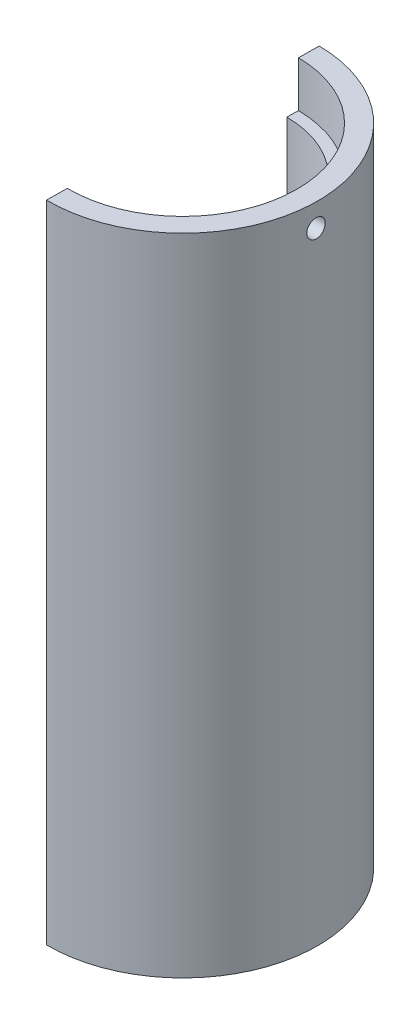
ISO-10303-21;
HEADER;
FILE_DESCRIPTION(('STEP AP214'),'2;1');
FILE_NAME('part.step','',(''),(''),'','','');
FILE_SCHEMA(('AUTOMOTIVE_DESIGN { 1 0 10303 214 1 1 1 1 }'));
ENDSEC;
DATA;
#1=APPLICATION_CONTEXT('core data for automotive mechanical design processes');
#2=APPLICATION_PROTOCOL_DEFINITION('international standard','automotive_design',2000,#1);
#3=PRODUCT_CONTEXT('',#1,'mechanical');
#4=PRODUCT('Part','Part','',(#3));
#5=PRODUCT_RELATED_PRODUCT_CATEGORY('part','',(#4));
#6=PRODUCT_DEFINITION_FORMATION('','',#4);
#7=PRODUCT_DEFINITION_CONTEXT('part definition',#1,'design');
#8=PRODUCT_DEFINITION('design','',#6,#7);
#9=PRODUCT_DEFINITION_SHAPE('','',#8);
#10=(LENGTH_UNIT() NAMED_UNIT(*) SI_UNIT(.MILLI.,.METRE.));
#11=(NAMED_UNIT(*) PLANE_ANGLE_UNIT() SI_UNIT($,.RADIAN.));
#12=(NAMED_UNIT(*) SI_UNIT($,.STERADIAN.) SOLID_ANGLE_UNIT());
#13=UNCERTAINTY_MEASURE_WITH_UNIT(LENGTH_MEASURE(1.E-05),#10,'distance_accuracy_value','');
#14=(GEOMETRIC_REPRESENTATION_CONTEXT(3) GLOBAL_UNCERTAINTY_ASSIGNED_CONTEXT((#13)) GLOBAL_UNIT_ASSIGNED_CONTEXT((#10,
#11,#12)) REPRESENTATION_CONTEXT('',''));
#15=CARTESIAN_POINT('',(0.,0.,0.));
#16=DIRECTION('',(0.,0.,1.));
#17=DIRECTION('',(1.,0.,0.));
#18=AXIS2_PLACEMENT_3D('',#15,#16,#17);
#19=CARTESIAN_POINT('',(0.,158.,0.));
#20=DIRECTION('',(0.,-1.,0.));
#21=DIRECTION('',(-0.401283076270889,0.,0.915954088750398));
#22=AXIS2_PLACEMENT_3D('',#19,#20,#21);
#23=CYLINDRICAL_SURFACE('',#22,22.5);
#24=DIRECTION('',(0.,-1.,0.));
#25=VECTOR('',#24,1.);
#26=CARTESIAN_POINT('',(-0.246759675838968,158.,22.4986468406965));
#27=LINE('',#26,#25);
#28=CARTESIAN_POINT('',(-0.246759675838986,119.,22.4986468406965));
#29=VERTEX_POINT('',#28);
#30=CARTESIAN_POINT('',(-0.246759675838977,157.,22.4986468406965));
#31=VERTEX_POINT('',#30);
#32=EDGE_CURVE('E339',#29,#31,#27,.F.);
#33=ORIENTED_EDGE('',*,*,#32,.T.);
#34=CARTESIAN_POINT('',(0.,157.,0.));
#35=DIRECTION('',(0.,-1.,0.));
#36=DIRECTION('',(0.,0.,1.));
#37=AXIS2_PLACEMENT_3D('',#34,#35,#36);
#38=CIRCLE('',#37,22.5);
#39=CARTESIAN_POINT('',(0.246759675839023,157.,-22.4986468406964));
#40=VERTEX_POINT('',#39);
#41=EDGE_CURVE('E186',#40,#31,#38,.T.);
#42=ORIENTED_EDGE('',*,*,#41,.F.);
#43=DIRECTION('',(0.,-1.,0.));
#44=VECTOR('',#43,1.);
#45=CARTESIAN_POINT('',(0.246759675839024,158.,-22.4986468406964));
#46=LINE('',#45,#44);
#47=CARTESIAN_POINT('',(0.246759675838999,119.,-22.4986468406964));
#48=VERTEX_POINT('',#47);
#49=EDGE_CURVE('E172',#48,#40,#46,.F.);
#50=ORIENTED_EDGE('',*,*,#49,.F.);
#51=CARTESIAN_POINT('',(0.,119.,0.));
#52=DIRECTION('',(0.,1.,0.));
#53=DIRECTION('',(0.,0.,-1.));
#54=AXIS2_PLACEMENT_3D('',#51,#52,#53);
#55=CIRCLE('',#54,22.5);
#56=EDGE_CURVE('E194',#29,#48,#55,.T.);
#57=ORIENTED_EDGE('',*,*,#56,.F.);
#58=EDGE_LOOP('',(#33,#42,#50,#57));
#59=FACE_BOUND('',#58,.T.);
#60=ADVANCED_FACE('F49',(#59),#23,.F.);
#61=CARTESIAN_POINT('',(0.112412741215621,247.,-10.2493835607617));
#62=DIRECTION('',(0.999939859586508,0.,0.0109670967039555));
#63=DIRECTION('',(-0.0109670967039554,0.,0.999939859586508));
#64=AXIS2_PLACEMENT_3D('',#61,#62,#63);
#65=PLANE('',#64);
#66=DIRECTION('',(-0.0109670967039562,0.,0.999939859586508));
#67=VECTOR('',#66,1.);
#68=CARTESIAN_POINT('',(0.257726772542979,157.,-23.4985867002829));
#69=LINE('',#68,#67);
#70=CARTESIAN_POINT('',(0.257726772542979,157.,-23.4985867002829));
#71=VERTEX_POINT('',#70);
#72=EDGE_CURVE('E176',#71,#40,#69,.T.);
#73=ORIENTED_EDGE('',*,*,#72,.F.);
#74=DIRECTION('',(0.,-1.,0.));
#75=VECTOR('',#74,1.);
#76=CARTESIAN_POINT('',(0.257726772542985,170.,-23.4985867002829));
#77=LINE('',#76,#75);
#78=CARTESIAN_POINT('',(0.257726772542985,170.,-23.4985867002829));
#79=VERTEX_POINT('',#78);
#80=EDGE_CURVE('E160',#71,#79,#77,.F.);
#81=ORIENTED_EDGE('',*,*,#80,.T.);
#82=DIRECTION('',(0.0109670967039554,0.,-0.999939859586508));
#83=VECTOR('',#82,1.);
#84=CARTESIAN_POINT('',(0.,170.,0.));
#85=LINE('',#84,#83);
#86=CARTESIAN_POINT('',(0.246759675839029,170.,-22.4986468406964));
#87=VERTEX_POINT('',#86);
#88=EDGE_CURVE('E324',#87,#79,#85,.T.);
#89=ORIENTED_EDGE('',*,*,#88,.F.);
#90=DIRECTION('',(0.,-1.,0.));
#91=VECTOR('',#90,1.);
#92=CARTESIAN_POINT('',(0.24675967583907,247.,-22.4986468406963));
#93=LINE('',#92,#91);
#94=CARTESIAN_POINT('',(0.246759675839067,237.,-22.4986468406963));
#95=VERTEX_POINT('',#94);
#96=EDGE_CURVE('E309',#87,#95,#93,.F.);
#97=ORIENTED_EDGE('',*,*,#96,.T.);
#98=DIRECTION('',(0.0109670967039554,0.,-0.999939859586508));
#99=VECTOR('',#98,1.);
#100=CARTESIAN_POINT('',(0.,237.,1.28191555927795E-13));
#101=LINE('',#100,#99);
#102=CARTESIAN_POINT('',(0.274177417598957,237.,-24.9984964896626));
#103=VERTEX_POINT('',#102);
#104=EDGE_CURVE('E59',#95,#103,#101,.T.);
#105=ORIENTED_EDGE('',*,*,#104,.T.);
#106=DIRECTION('',(0.,1.,0.));
#107=VECTOR('',#106,1.);
#108=CARTESIAN_POINT('',(0.274177417598957,237.,-24.9984964896626));
#109=LINE('',#108,#107);
#110=CARTESIAN_POINT('',(0.27417741759896,247.,-24.9984964896626));
#111=VERTEX_POINT('',#110);
#112=EDGE_CURVE('E293',#111,#103,#109,.F.);
#113=ORIENTED_EDGE('',*,*,#112,.F.);
#114=DIRECTION('',(0.0109670967039554,0.,-0.999939859586508));
#115=VECTOR('',#114,1.);
#116=CARTESIAN_POINT('',(0.,247.,1.33348633457717E-13));
#117=LINE('',#116,#115);
#118=CARTESIAN_POINT('',(0.323529352766761,247.,-29.4982258578019));
#119=VERTEX_POINT('',#118);
#120=EDGE_CURVE('E283',#111,#119,#117,.T.);
#121=ORIENTED_EDGE('',*,*,#120,.T.);
#122=DIRECTION('',(0.,-1.,0.));
#123=VECTOR('',#122,1.);
#124=CARTESIAN_POINT('',(0.323529352766681,106.,-29.498225857802));
#125=LINE('',#124,#123);
#126=CARTESIAN_POINT('',(0.323529352766681,106.,-29.498225857802));
#127=VERTEX_POINT('',#126);
#128=EDGE_CURVE('E286',#127,#119,#125,.F.);
#129=ORIENTED_EDGE('',*,*,#128,.F.);
#130=DIRECTION('',(0.0109670967039554,0.,-0.999939859586508));
#131=VECTOR('',#130,1.);
#132=CARTESIAN_POINT('',(0.112412741215542,106.,-10.2493835607618));
#133=LINE('',#132,#131);
#134=CARTESIAN_POINT('',(0.257726772542949,106.,-23.4985867002829));
#135=VERTEX_POINT('',#134);
#136=EDGE_CURVE('E11',#135,#127,#133,.T.);
#137=ORIENTED_EDGE('',*,*,#136,.F.);
#138=DIRECTION('',(0.,-1.,0.));
#139=VECTOR('',#138,1.);
#140=CARTESIAN_POINT('',(0.257726772542954,118.,-23.4985867002829));
#141=LINE('',#140,#139);
#142=CARTESIAN_POINT('',(0.257726772542958,119.,-23.4985867002829));
#143=VERTEX_POINT('',#142);
#144=EDGE_CURVE('E278',#135,#143,#141,.F.);
#145=ORIENTED_EDGE('',*,*,#144,.T.);
#146=DIRECTION('',(0.0109670967039588,0.,-0.999939859586508));
#147=VECTOR('',#146,1.);
#148=CARTESIAN_POINT('',(0.246759675838999,119.,-22.4986468406964));
#149=LINE('',#148,#147);
#150=EDGE_CURVE('E197',#48,#143,#149,.T.);
#151=ORIENTED_EDGE('',*,*,#150,.F.);
#152=ORIENTED_EDGE('',*,*,#49,.T.);
#153=EDGE_LOOP('',(#73,#81,#89,#97,#105,#113,#121,#129,#137,#145,#151,#152));
#154=FACE_BOUND('',#153,.T.);
#155=ADVANCED_FACE('F51',(#154),#65,.F.);
#156=CARTESIAN_POINT('',(0.112412741215542,106.,-10.2493835607618));
#157=DIRECTION('',(0.,1.,0.));
#158=DIRECTION('',(0.401283076270889,0.,-0.915954088750398));
#159=AXIS2_PLACEMENT_3D('',#156,#157,#158);
#160=PLANE('',#159);
#161=CARTESIAN_POINT('',(0.,106.,0.));
#162=DIRECTION('',(0.,1.,0.));
#163=DIRECTION('',(0.401283076270889,0.,-0.915954088750398));
#164=AXIS2_PLACEMENT_3D('',#161,#162,#163);
#165=CIRCLE('',#164,29.5);
#166=CARTESIAN_POINT('',(-0.323529352766688,106.,29.498225857802));
#167=VERTEX_POINT('',#166);
#168=EDGE_CURVE('E53',#167,#127,#165,.T.);
#169=ORIENTED_EDGE('',*,*,#168,.F.);
#170=DIRECTION('',(-0.0109670967039554,0.,0.999939859586508));
#171=VECTOR('',#170,1.);
#172=CARTESIAN_POINT('',(0.112412741215542,106.,-10.2493835607618));
#173=LINE('',#172,#171);
#174=CARTESIAN_POINT('',(-0.257726772542956,106.,23.498586700283));
#175=VERTEX_POINT('',#174);
#176=EDGE_CURVE('E206',#175,#167,#173,.T.);
#177=ORIENTED_EDGE('',*,*,#176,.F.);
#178=CARTESIAN_POINT('',(0.,106.,0.));
#179=DIRECTION('',(0.,1.,0.));
#180=DIRECTION('',(0.401283076270889,0.,-0.915954088750398));
#181=AXIS2_PLACEMENT_3D('',#178,#179,#180);
#182=CIRCLE('',#181,23.5);
#183=EDGE_CURVE('E280',#135,#175,#182,.F.);
#184=ORIENTED_EDGE('',*,*,#183,.F.);
#185=ORIENTED_EDGE('',*,*,#136,.T.);
#186=EDGE_LOOP('',(#169,#177,#184,#185));
#187=FACE_BOUND('',#186,.T.);
#188=ADVANCED_FACE('F289',(#187),#160,.F.);
#189=CARTESIAN_POINT('',(0.112412741215621,247.,-10.2493835607617));
#190=DIRECTION('',(-0.999939859586508,0.,-0.0109670967039555));
#191=DIRECTION('',(0.0109670967039554,0.,-0.999939859586508));
#192=AXIS2_PLACEMENT_3D('',#189,#190,#191);
#193=PLANE('',#192);
#194=DIRECTION('',(0.,-1.,0.));
#195=VECTOR('',#194,1.);
#196=CARTESIAN_POINT('',(-0.257726772542919,170.,23.498586700283));
#197=LINE('',#196,#195);
#198=CARTESIAN_POINT('',(-0.257726772542925,157.,23.498586700283));
#199=VERTEX_POINT('',#198);
#200=CARTESIAN_POINT('',(-0.257726772542919,170.,23.498586700283));
#201=VERTEX_POINT('',#200);
#202=EDGE_CURVE('E319',#199,#201,#197,.F.);
#203=ORIENTED_EDGE('',*,*,#202,.F.);
#204=DIRECTION('',(-0.0109670967039494,0.,0.999939859586509));
#205=VECTOR('',#204,1.);
#206=CARTESIAN_POINT('',(-0.246759675838975,157.,22.4986468406965));
#207=LINE('',#206,#205);
#208=EDGE_CURVE('E179',#31,#199,#207,.T.);
#209=ORIENTED_EDGE('',*,*,#208,.F.);
#210=ORIENTED_EDGE('',*,*,#32,.F.);
#211=DIRECTION('',(0.010967096703959,0.,-0.999939859586508));
#212=VECTOR('',#211,1.);
#213=CARTESIAN_POINT('',(-0.257726772542947,119.,23.498586700283));
#214=LINE('',#213,#212);
#215=CARTESIAN_POINT('',(-0.257726772542938,119.,23.498586700283));
#216=VERTEX_POINT('',#215);
#217=EDGE_CURVE('E70',#216,#29,#214,.T.);
#218=ORIENTED_EDGE('',*,*,#217,.F.);
#219=DIRECTION('',(0.,-1.,0.));
#220=VECTOR('',#219,1.);
#221=CARTESIAN_POINT('',(-0.257726772542949,118.,23.498586700283));
#222=LINE('',#221,#220);
#223=EDGE_CURVE('E325',#175,#216,#222,.F.);
#224=ORIENTED_EDGE('',*,*,#223,.F.);
#225=ORIENTED_EDGE('',*,*,#176,.T.);
#226=DIRECTION('',(0.,-1.,0.));
#227=VECTOR('',#226,1.);
#228=CARTESIAN_POINT('',(-0.323529352766688,106.,29.498225857802));
#229=LINE('',#228,#227);
#230=CARTESIAN_POINT('',(-0.32352935276661,247.,29.4982258578021));
#231=VERTEX_POINT('',#230);
#232=EDGE_CURVE('E336',#167,#231,#229,.F.);
#233=ORIENTED_EDGE('',*,*,#232,.T.);
#234=DIRECTION('',(-0.0109670967039554,0.,0.999939859586508));
#235=VECTOR('',#234,1.);
#236=CARTESIAN_POINT('',(0.,247.,1.33348633457717E-13));
#237=LINE('',#236,#235);
#238=CARTESIAN_POINT('',(-0.274177417598813,247.,24.9984964896628));
#239=VERTEX_POINT('',#238);
#240=EDGE_CURVE('E316',#239,#231,#237,.T.);
#241=ORIENTED_EDGE('',*,*,#240,.F.);
#242=DIRECTION('',(0.,1.,0.));
#243=VECTOR('',#242,1.);
#244=CARTESIAN_POINT('',(-0.274177417598815,237.,24.9984964896628));
#245=LINE('',#244,#243);
#246=CARTESIAN_POINT('',(-0.274177417598815,237.,24.9984964896628));
#247=VERTEX_POINT('',#246);
#248=EDGE_CURVE('E171',#239,#247,#245,.F.);
#249=ORIENTED_EDGE('',*,*,#248,.T.);
#250=DIRECTION('',(-0.0109670967039554,0.,0.999939859586508));
#251=VECTOR('',#250,1.);
#252=CARTESIAN_POINT('',(0.,237.,1.28191555927795E-13));
#253=LINE('',#252,#251);
#254=CARTESIAN_POINT('',(-0.246759675838923,237.,22.4986468406966));
#255=VERTEX_POINT('',#254);
#256=EDGE_CURVE('E247',#255,#247,#253,.T.);
#257=ORIENTED_EDGE('',*,*,#256,.F.);
#258=DIRECTION('',(0.,-1.,0.));
#259=VECTOR('',#258,1.);
#260=CARTESIAN_POINT('',(-0.24675967583892,247.,22.4986468406966));
#261=LINE('',#260,#259);
#262=CARTESIAN_POINT('',(-0.246759675838963,170.,22.4986468406965));
#263=VERTEX_POINT('',#262);
#264=EDGE_CURVE('E311',#263,#255,#261,.F.);
#265=ORIENTED_EDGE('',*,*,#264,.F.);
#266=DIRECTION('',(-0.0109670967039554,0.,0.999939859586508));
#267=VECTOR('',#266,1.);
#268=CARTESIAN_POINT('',(0.,170.,0.));
#269=LINE('',#268,#267);
#270=EDGE_CURVE('E328',#263,#201,#269,.T.);
#271=ORIENTED_EDGE('',*,*,#270,.T.);
#272=EDGE_LOOP('',(#203,#209,#210,#218,#224,#225,#233,#241,#249,#257,#265,#271));
#273=FACE_BOUND('',#272,.T.);
#274=ADVANCED_FACE('F267',(#273),#193,.T.);
#275=CARTESIAN_POINT('',(0.,106.,0.));
#276=DIRECTION('',(0.,-1.,0.));
#277=DIRECTION('',(-0.401283076270889,0.,0.915954088750398));
#278=AXIS2_PLACEMENT_3D('',#275,#276,#277);
#279=CYLINDRICAL_SURFACE('',#278,29.5);
#280=ORIENTED_EDGE('',*,*,#168,.T.);
#281=ORIENTED_EDGE('',*,*,#128,.T.);
#282=CARTESIAN_POINT('',(0.,247.,1.33343877237688E-13));
#283=DIRECTION('',(0.,1.,0.));
#284=DIRECTION('',(0.401283076270889,0.,-0.915954088750398));
#285=AXIS2_PLACEMENT_3D('',#282,#283,#284);
#286=CIRCLE('',#285,29.5);
#287=EDGE_CURVE('E295',#231,#119,#286,.T.);
#288=ORIENTED_EDGE('',*,*,#287,.F.);
#289=ORIENTED_EDGE('',*,*,#232,.F.);
#290=EDGE_LOOP('',(#280,#281,#288,#289));
#291=FACE_BOUND('',#290,.T.);
#292=CARTESIAN_POINT('',(29.4084210519292,242.,2.32266468360173));
#293=CARTESIAN_POINT('',(29.4084220120332,242.112202285115,2.32265976436561));
#294=CARTESIAN_POINT('',(29.4091734268653,242.224482640083,2.31319861341218));
#295=CARTESIAN_POINT('',(29.4121067242641,242.445941578137,2.27559223731867));
#296=CARTESIAN_POINT('',(29.4142902617678,242.55511642007,2.24742539572096));
#297=CARTESIAN_POINT('',(29.4198655907828,242.767124504594,2.17321993342856));
#298=CARTESIAN_POINT('',(29.4232567337118,242.869961116618,2.12719090499129));
#299=CARTESIAN_POINT('',(29.430906893695,243.066416403162,2.01858088401622));
#300=CARTESIAN_POINT('',(29.4351657149756,243.160037149997,1.95600362429721));
#301=CARTESIAN_POINT('',(29.444137592895,243.335592840977,1.8159510342851));
#302=CARTESIAN_POINT('',(29.4488513396047,243.417509549347,1.73845288774862));
#303=CARTESIAN_POINT('',(29.4582690308026,243.567175613971,1.57080226663083));
#304=CARTESIAN_POINT('',(29.4629729748692,243.634924373018,1.48064925889107));
#305=CARTESIAN_POINT('',(29.4719294668647,243.754388659313,1.29014018911092));
#306=CARTESIAN_POINT('',(29.4761815825413,243.806088922616,1.18977453338961));
#307=CARTESIAN_POINT('',(29.4838427268428,243.8918909368,0.981753371019112));
#308=CARTESIAN_POINT('',(29.4872517657912,243.925992903181,0.874097953654704));
#309=CARTESIAN_POINT('',(29.4929371989243,243.97557921303,0.65472830701561));
#310=CARTESIAN_POINT('',(29.4952153424178,243.991092363225,0.543020634978423));
#311=CARTESIAN_POINT('',(29.498493341226,244.003149660578,0.318568448921587));
#312=CARTESIAN_POINT('',(29.4994932130794,243.999694053164,0.205823948335827));
#313=CARTESIAN_POINT('',(29.5002056085473,243.973935640675,-0.0173061036636653));
#314=CARTESIAN_POINT('',(29.499920245198,243.951663820011,-0.127695227446173));
#315=CARTESIAN_POINT('',(29.4982007364721,243.888953300624,-0.34317697798144));
#316=CARTESIAN_POINT('',(29.4967665833492,243.848514479402,-0.448269569014518));
#317=CARTESIAN_POINT('',(29.4930054665684,243.750582908417,-0.650271975616107));
#318=CARTESIAN_POINT('',(29.4906777693063,243.693076154621,-0.747174987526397));
#319=CARTESIAN_POINT('',(29.4854799949416,243.562651305947,-0.929970018999141));
#320=CARTESIAN_POINT('',(29.4826099106212,243.48973300598,-1.01586189200757));
#321=CARTESIAN_POINT('',(29.4767224034061,243.330380036604,-1.17437397884964));
#322=CARTESIAN_POINT('',(29.4737046956809,243.243918467079,-1.24696714202696));
#323=CARTESIAN_POINT('',(29.4679346507272,243.060027415318,-1.37660888512965));
#324=CARTESIAN_POINT('',(29.4651823136253,242.962597927841,-1.43365745762726));
#325=CARTESIAN_POINT('',(29.4603067562287,242.759519100822,-1.53058576455017));
#326=CARTESIAN_POINT('',(29.4581835799093,242.653869187362,-1.57046429896034));
#327=CARTESIAN_POINT('',(29.4548444219778,242.437356671315,-1.63189915134323));
#328=CARTESIAN_POINT('',(29.4536284277958,242.326494140978,-1.65345572318754));
#329=CARTESIAN_POINT('',(29.4522632200991,242.102939511937,-1.6775995382469));
#330=CARTESIAN_POINT('',(29.4521118888875,241.990251492285,-1.68022443828263));
#331=CARTESIAN_POINT('',(29.4528899666546,241.766037131851,-1.66652867775531));
#332=CARTESIAN_POINT('',(29.453819369001,241.654510783943,-1.65020813345916));
#333=CARTESIAN_POINT('',(29.4566371353761,241.435892372325,-1.59911709801961));
#334=CARTESIAN_POINT('',(29.4585245952288,241.328796230441,-1.56436400139068));
#335=CARTESIAN_POINT('',(29.4630129439798,241.121952317883,-1.47741410221898));
#336=CARTESIAN_POINT('',(29.4656138404885,241.022204625609,-1.42521711359872));
#337=CARTESIAN_POINT('',(29.4711928346666,240.83271637313,-1.30476803306612));
#338=CARTESIAN_POINT('',(29.474171520773,240.742991843884,-1.23649074953034));
#339=CARTESIAN_POINT('',(29.4801047475575,240.576258478335,-1.08585928583884));
#340=CARTESIAN_POINT('',(29.4830592879584,240.499249787876,-1.00350494424873));
#341=CARTESIAN_POINT('',(29.4885408536016,240.36000667794,-0.826898485595481));
#342=CARTESIAN_POINT('',(29.4910671716046,240.297796632423,-0.732627126405968));
#343=CARTESIAN_POINT('',(29.4953144454842,240.19008361552,-0.534962605191326));
#344=CARTESIAN_POINT('',(29.4970354070374,240.144580526374,-0.431569507467902));
#345=CARTESIAN_POINT('',(29.4993811360519,240.071615363988,-0.21868820956401));
#346=CARTESIAN_POINT('',(29.5000068366792,240.04413794531,-0.1092052800907));
#347=CARTESIAN_POINT('',(29.4999930526331,240.007953901931,0.112819396525069));
#348=CARTESIAN_POINT('',(29.4993535830162,239.999247053848,0.225361107250123));
#349=CARTESIAN_POINT('',(29.4967801607378,240.000853557772,0.450067154595547));
#350=CARTESIAN_POINT('',(29.4948488065581,240.011128802363,0.562231795403566));
#351=CARTESIAN_POINT('',(29.4898080454503,240.050328698884,0.78322576668621));
#352=CARTESIAN_POINT('',(29.4866986365402,240.079253382193,0.892055091548803));
#353=CARTESIAN_POINT('',(29.4795508171104,240.154922211972,1.10329584739434));
#354=CARTESIAN_POINT('',(29.4755124217599,240.201666067485,1.2057073831372));
#355=CARTESIAN_POINT('',(29.4668653190825,240.311641369302,1.40122688179467));
#356=CARTESIAN_POINT('',(29.4622566252278,240.374872426165,1.49433506438973));
#357=CARTESIAN_POINT('',(29.4528905290527,240.516168942565,1.66880196572947));
#358=CARTESIAN_POINT('',(29.4481328624734,240.594262175756,1.75013817648692));
#359=CARTESIAN_POINT('',(29.4389359183454,240.76302465399,1.89857809259877));
#360=CARTESIAN_POINT('',(29.4344967188067,240.853696964481,1.96567831861404));
#361=CARTESIAN_POINT('',(29.426370541703,241.045163536418,2.08380379392782));
#362=CARTESIAN_POINT('',(29.4226846121643,241.145971612926,2.13480669994219));
#363=CARTESIAN_POINT('',(29.4164469637509,241.354675518109,2.21911055427343));
#364=CARTESIAN_POINT('',(29.4138939225591,241.46256291393,2.25243214931489));
#365=CARTESIAN_POINT('',(29.4108455379735,241.642587641303,2.2918083362102));
#366=CARTESIAN_POINT('',(29.4099400388713,241.713562535742,2.30336443667684));
#367=CARTESIAN_POINT('',(29.4087274889752,241.85634761886,2.31879417883486));
#368=CARTESIAN_POINT('',(29.4084204371826,241.928157806145,2.32266783334787));
#369=CARTESIAN_POINT('',(29.4084210519292,242.,2.32266468360173));
#370=B_SPLINE_CURVE_WITH_KNOTS('',3,(#292,#293,#294,#295,#296,#297,#298,#299,#300,#301,#302,
#303,#304,#305,#306,#307,#308,#309,#310,#311,#312,#313,#314,#315,#316,#317,#318,#319,#320,#321,
#322,#323,#324,#325,#326,#327,#328,#329,#330,#331,#332,#333,#334,#335,#336,#337,#338,#339,#340,
#341,#342,#343,#344,#345,#346,#347,#348,#349,#350,#351,#352,#353,#354,#355,#356,#357,#358,#359,
#360,#361,#362,#363,#364,#365,#366,#367,#368,#369),.UNSPECIFIED.,.T.,.F.,(4,2,2,2,2,2,2,2,2,2,2,
2,2,2,2,2,2,2,2,2,2,2,2,2,2,2,2,2,2,2,2,2,2,2,2,2,2,2,4),(0.,0.336344577659572,
0.673078515941869,1.00963187282268,1.34610937732773,1.68310555195412,2.0201159287366,
2.35744586547342,2.6947716713509,3.03157405113571,3.36837207320016,3.7046165729478,
4.04086334001643,4.37738675977417,4.71391465806419,5.05111965976264,5.38832482258944,
5.72555354888415,6.06277760241587,6.39933070110743,6.73588173440665,7.07211573331286,
7.4083533190086,7.74512120503262,8.08189295333861,8.41921559612666,8.75653586122229,
9.09356858818394,9.430597304239,9.76695015494149,10.1033035715632,10.4396514963348,
10.775991477032,11.1129662761444,11.4500233387894,11.7875462041373,12.1246740669139,
12.340033073674,12.5553917210098),.UNSPECIFIED.);
#371=CARTESIAN_POINT('',(29.4084210519292,242.,2.32266468360173));
#372=VERTEX_POINT('',#371);
#373=EDGE_CURVE('E207',#372,#372,#370,.T.);
#374=ORIENTED_EDGE('',*,*,#373,.T.);
#375=EDGE_LOOP('',(#374));
#376=FACE_BOUND('',#375,.T.);
#377=ADVANCED_FACE('F220',(#291,#376),#279,.T.);
#378=CARTESIAN_POINT('',(0.,247.,1.33343877237688E-13));
#379=DIRECTION('',(0.,1.,0.));
#380=DIRECTION('',(0.401283076270889,0.,-0.915954088750398));
#381=AXIS2_PLACEMENT_3D('',#378,#379,#380);
#382=PLANE('',#381);
#383=ORIENTED_EDGE('',*,*,#120,.F.);
#384=CARTESIAN_POINT('',(0.,247.,1.36309110168405E-13));
#385=DIRECTION('',(0.,1.,0.));
#386=DIRECTION('',(0.401283076270889,0.,-0.915954088750398));
#387=AXIS2_PLACEMENT_3D('',#384,#385,#386);
#388=CIRCLE('',#387,25.);
#389=EDGE_CURVE('E216',#239,#111,#388,.T.);
#390=ORIENTED_EDGE('',*,*,#389,.F.);
#391=ORIENTED_EDGE('',*,*,#240,.T.);
#392=ORIENTED_EDGE('',*,*,#287,.T.);
#393=EDGE_LOOP('',(#383,#390,#391,#392));
#394=FACE_BOUND('',#393,.T.);
#395=ADVANCED_FACE('F230',(#394),#382,.T.);
#396=CARTESIAN_POINT('',(-42.4974440324266,242.,-0.466101609917994));
#397=DIRECTION('',(0.999939859586508,0.,0.0109670967039554));
#398=DIRECTION('',(-0.0109670967039553,0.,0.999939859586508));
#399=AXIS2_PLACEMENT_3D('',#396,#397,#398);
#400=CYLINDRICAL_SURFACE('',#399,2.);
#401=CARTESIAN_POINT('',(24.8964387039649,242.,2.27317836073714));
#402=CARTESIAN_POINT('',(24.896439821218,241.887852146326,2.27317346686614));
#403=CARTESIAN_POINT('',(24.8973076604846,241.775627553608,2.26372273820471));
#404=CARTESIAN_POINT('',(24.9006938559735,241.554282343585,2.2261597833425));
#405=CARTESIAN_POINT('',(24.9032140914608,241.445165408219,2.19802630884708));
#406=CARTESIAN_POINT('',(24.9096440367344,241.233273441822,2.12391366170939));
#407=CARTESIAN_POINT('',(24.9135529684198,241.130494897094,2.07794448127426));
#408=CARTESIAN_POINT('',(24.9223613677533,240.934144292345,1.96947967310415));
#409=CARTESIAN_POINT('',(24.9272606208931,240.840570245099,1.90698762340052));
#410=CARTESIAN_POINT('',(24.9375684709039,240.665037588918,1.76708635603931));
#411=CARTESIAN_POINT('',(24.942978118671,240.583103855833,1.68964600156202));
#412=CARTESIAN_POINT('',(24.9537616307937,240.433391219468,1.52210778480448));
#413=CARTESIAN_POINT('',(24.9591354935889,240.365612929514,1.43200937435918));
#414=CARTESIAN_POINT('',(24.9693335367477,240.24605323297,1.24156132151012));
#415=CARTESIAN_POINT('',(24.9741569764146,240.194293225377,1.14119820233208));
#416=CARTESIAN_POINT('',(24.9827948656352,240.108376259337,0.933160169316869));
#417=CARTESIAN_POINT('',(24.9866093316172,240.07421901427,0.825485374565353));
#418=CARTESIAN_POINT('',(24.9928913966692,240.024548436804,0.606124570455599));
#419=CARTESIAN_POINT('',(24.9953618851589,240.008995020947,0.494447720905179));
#420=CARTESIAN_POINT('',(24.9987932707288,239.996849716636,0.270045738311089));
#421=CARTESIAN_POINT('',(24.9997541939035,240.000257500412,0.157320623421698));
#422=CARTESIAN_POINT('',(25.0001618741609,240.025905032215,-0.0657060371606811));
#423=CARTESIAN_POINT('',(24.9996120906237,240.048101674888,-0.176012537868251));
#424=CARTESIAN_POINT('',(24.997168873999,240.11062984172,-0.39134376746273));
#425=CARTESIAN_POINT('',(24.9952754289801,240.150961526914,-0.496368449438961));
#426=CARTESIAN_POINT('',(24.9904504599225,240.248663090429,-0.698289409382496));
#427=CARTESIAN_POINT('',(24.9875177564597,240.306052314872,-0.795176296824752));
#428=CARTESIAN_POINT('',(24.9810320485548,240.436225837509,-0.9779650935034));
#429=CARTESIAN_POINT('',(24.9774790325329,240.509010423103,-1.06386679762046));
#430=CARTESIAN_POINT('',(24.9702191225868,240.668151616262,-1.22249475247285));
#431=CARTESIAN_POINT('',(24.966511825485,240.754545672068,-1.29518342061644));
#432=CARTESIAN_POINT('',(24.959437871794,240.938322766536,-1.42502738680839));
#433=CARTESIAN_POINT('',(24.9560712154548,241.03570581326,-1.48218267346065));
#434=CARTESIAN_POINT('',(24.9501120423946,241.238722485724,-1.57933208832999));
#435=CARTESIAN_POINT('',(24.9475196107468,241.344357016543,-1.61932433085397));
#436=CARTESIAN_POINT('',(24.9434412690636,241.560865785508,-1.68098209562102));
#437=CARTESIAN_POINT('',(24.9419553376118,241.671739922198,-1.70264797257261));
#438=CARTESIAN_POINT('',(24.9402818905969,241.895251896495,-1.72698890222354));
#439=CARTESIAN_POINT('',(24.9400907907444,242.007883999623,-1.7297163797901));
#440=CARTESIAN_POINT('',(24.9410217032883,242.232003494728,-1.71624014627882));
#441=CARTESIAN_POINT('',(24.9421437044109,242.343490896526,-1.70003659773637));
#442=CARTESIAN_POINT('',(24.9455561134001,242.562006294686,-1.64920315305008));
#443=CARTESIAN_POINT('',(24.9478449734909,242.669039995736,-1.61459766348135));
#444=CARTESIAN_POINT('',(24.9532999935024,242.875786298847,-1.52796991716825));
#445=CARTESIAN_POINT('',(24.9564661664131,242.97549879248,-1.47594740253732));
#446=CARTESIAN_POINT('',(24.9632796288909,243.165012079284,-1.35583290137279));
#447=CARTESIAN_POINT('',(24.9669279572698,243.254790679814,-1.28770596028175));
#448=CARTESIAN_POINT('',(24.9742274271944,243.42166353055,-1.13737112586925));
#449=CARTESIAN_POINT('',(24.9778785687839,243.498757579397,-1.05516300906083));
#450=CARTESIAN_POINT('',(24.9847061808342,243.638251376675,-0.878777297576226));
#451=CARTESIAN_POINT('',(24.9878815466043,243.700617115365,-0.784572758185567));
#452=CARTESIAN_POINT('',(24.993302606666,243.808650719895,-0.587006857217541));
#453=CARTESIAN_POINT('',(24.9955483096197,243.854318741316,-0.483645580968781));
#454=CARTESIAN_POINT('',(24.9987590954141,243.927602020653,-0.270825842406626));
#455=CARTESIAN_POINT('',(24.9997256777609,243.955238397657,-0.161374676441415));
#456=CARTESIAN_POINT('',(25.0001728000693,243.991742933376,0.0606165132573289));
#457=CARTESIAN_POINT('',(24.9996533657353,244.000611416724,0.173156483528627));
#458=CARTESIAN_POINT('',(24.99708667784,243.999324763226,0.397794572646053));
#459=CARTESIAN_POINT('',(24.9950436936963,243.989222667443,0.509893047899474));
#460=CARTESIAN_POINT('',(24.9895612330824,243.950392113785,0.730780283162179));
#461=CARTESIAN_POINT('',(24.9861217545976,243.921663629041,0.839569038396728));
#462=CARTESIAN_POINT('',(24.9781322190562,243.846409034824,1.05075496963364));
#463=CARTESIAN_POINT('',(24.9735822141898,243.799883761672,1.15315244571677));
#464=CARTESIAN_POINT('',(24.9637867724864,243.690362495371,1.34868261965664));
#465=CARTESIAN_POINT('',(24.9585413478983,243.627366792311,1.44181548064898));
#466=CARTESIAN_POINT('',(24.9478412764822,243.486493997156,1.61644766681382));
#467=CARTESIAN_POINT('',(24.9423861099874,243.408577746229,1.69791537107538));
#468=CARTESIAN_POINT('',(24.9318161771248,243.240144389546,1.84665036159844));
#469=CARTESIAN_POINT('',(24.9267014936641,243.149624231228,1.91391419784009));
#470=CARTESIAN_POINT('',(24.917319707484,242.958390065511,2.03241961366353));
#471=CARTESIAN_POINT('',(24.9130541105818,242.857658417507,2.08363281893136));
#472=CARTESIAN_POINT('',(24.9058228629396,242.649058503573,2.16836637695046));
#473=CARTESIAN_POINT('',(24.9028557133042,242.541198632799,2.20190713951307));
#474=CARTESIAN_POINT('',(24.8992908903199,242.360581735918,2.24177225827355));
#475=CARTESIAN_POINT('',(24.8982257921459,242.288987464722,2.25353400158978));
#476=CARTESIAN_POINT('',(24.8967993387638,242.144939480372,2.26923862483552));
#477=CARTESIAN_POINT('',(24.8964379818383,242.072485769316,2.27318152384721));
#478=CARTESIAN_POINT('',(24.8964387039649,242.,2.27317836073714));
#479=B_SPLINE_CURVE_WITH_KNOTS('',3,(#401,#402,#403,#404,#405,#406,#407,#408,#409,#410,#411,
#412,#413,#414,#415,#416,#417,#418,#419,#420,#421,#422,#423,#424,#425,#426,#427,#428,#429,#430,
#431,#432,#433,#434,#435,#436,#437,#438,#439,#440,#441,#442,#443,#444,#445,#446,#447,#448,#449,
#450,#451,#452,#453,#454,#455,#456,#457,#458,#459,#460,#461,#462,#463,#464,#465,#466,#467,#468,
#469,#470,#471,#472,#473,#474,#475,#476,#477,#478),.UNSPECIFIED.,.T.,.F.,(4,2,2,2,2,2,2,2,2,2,2,
2,2,2,2,2,2,2,2,2,2,2,2,2,2,2,2,2,2,2,2,2,2,2,2,2,2,2,4),(0.,0.33617890938389,0.672740818698476,
1.00911444549431,1.34541529007445,1.68242434822534,2.01944800526567,2.35691997146199,
2.69438644255222,3.03112449746248,3.36785673142907,3.70381852241057,4.03978329672295,
4.37613057520014,4.71248413315912,5.04977992078597,5.38707595586997,5.7244090399802,
6.06173559482737,6.39812799600611,6.73451750905463,7.07046197594156,7.40641141723671,
7.74309684057558,8.07978760805432,8.41724840176259,8.75470605111588,9.09176774920678,
9.42882361697633,9.76493849142067,10.1010538507349,10.4371534170066,10.7732470640349,
11.1102351838792,11.4473050618614,11.7849674942507,12.122239102542,12.3395258855511,
12.5568121382634),.UNSPECIFIED.);
#480=CARTESIAN_POINT('',(24.8964387039649,242.,2.27317836073714));
#481=VERTEX_POINT('',#480);
#482=EDGE_CURVE('E217',#481,#481,#479,.T.);
#483=ORIENTED_EDGE('',*,*,#482,.F.);
#484=EDGE_LOOP('',(#483));
#485=FACE_BOUND('',#484,.T.);
#486=ORIENTED_EDGE('',*,*,#373,.F.);
#487=EDGE_LOOP('',(#486));
#488=FACE_BOUND('',#487,.T.);
#489=ADVANCED_FACE('F224',(#485,#488),#400,.F.);
#490=CARTESIAN_POINT('',(0.,237.,1.28158262387593E-13));
#491=DIRECTION('',(0.,1.,0.));
#492=DIRECTION('',(0.401283076270889,0.,-0.915954088750398));
#493=AXIS2_PLACEMENT_3D('',#490,#491,#492);
#494=CYLINDRICAL_SURFACE('',#493,25.);
#495=ORIENTED_EDGE('',*,*,#482,.T.);
#496=EDGE_LOOP('',(#495));
#497=FACE_BOUND('',#496,.T.);
#498=ORIENTED_EDGE('',*,*,#389,.T.);
#499=ORIENTED_EDGE('',*,*,#112,.T.);
#500=CARTESIAN_POINT('',(0.,237.,1.28158262387593E-13));
#501=DIRECTION('',(0.,1.,0.));
#502=DIRECTION('',(0.401283076270889,0.,-0.915954088750398));
#503=AXIS2_PLACEMENT_3D('',#500,#501,#502);
#504=CIRCLE('',#503,25.);
#505=EDGE_CURVE('E218',#247,#103,#504,.T.);
#506=ORIENTED_EDGE('',*,*,#505,.F.);
#507=ORIENTED_EDGE('',*,*,#248,.F.);
#508=EDGE_LOOP('',(#498,#499,#506,#507));
#509=FACE_BOUND('',#508,.T.);
#510=ADVANCED_FACE('F229',(#497,#509),#494,.F.);
#511=CARTESIAN_POINT('',(0.,247.,1.33343877237688E-13));
#512=DIRECTION('',(0.,-1.,0.));
#513=DIRECTION('',(-0.401283076270889,0.,0.915954088750398));
#514=AXIS2_PLACEMENT_3D('',#511,#512,#513);
#515=CYLINDRICAL_SURFACE('',#514,22.5);
#516=ORIENTED_EDGE('',*,*,#96,.F.);
#517=CARTESIAN_POINT('',(0.,170.,0.));
#518=DIRECTION('',(0.,1.,0.));
#519=DIRECTION('',(0.401283076270889,0.,-0.915954088750398));
#520=AXIS2_PLACEMENT_3D('',#517,#518,#519);
#521=CIRCLE('',#520,22.5);
#522=EDGE_CURVE('E300',#263,#87,#521,.T.);
#523=ORIENTED_EDGE('',*,*,#522,.F.);
#524=ORIENTED_EDGE('',*,*,#264,.T.);
#525=CARTESIAN_POINT('',(0.,237.,1.25193029456876E-13));
#526=DIRECTION('',(0.,1.,0.));
#527=DIRECTION('',(0.401283076270889,0.,-0.915954088750398));
#528=AXIS2_PLACEMENT_3D('',#525,#526,#527);
#529=CIRCLE('',#528,22.5);
#530=EDGE_CURVE('E245',#255,#95,#529,.T.);
#531=ORIENTED_EDGE('',*,*,#530,.T.);
#532=EDGE_LOOP('',(#516,#523,#524,#531));
#533=FACE_BOUND('',#532,.T.);
#534=ADVANCED_FACE('F252',(#533),#515,.F.);
#535=CARTESIAN_POINT('',(0.,237.,1.28158262387593E-13));
#536=DIRECTION('',(0.,1.,0.));
#537=DIRECTION('',(0.401283076270889,0.,-0.915954088750398));
#538=AXIS2_PLACEMENT_3D('',#535,#536,#537);
#539=PLANE('',#538);
#540=ORIENTED_EDGE('',*,*,#104,.F.);
#541=ORIENTED_EDGE('',*,*,#530,.F.);
#542=ORIENTED_EDGE('',*,*,#256,.T.);
#543=ORIENTED_EDGE('',*,*,#505,.T.);
#544=EDGE_LOOP('',(#540,#541,#542,#543));
#545=FACE_BOUND('',#544,.T.);
#546=ADVANCED_FACE('F234',(#545),#539,.T.);
#547=CARTESIAN_POINT('',(0.,118.,0.));
#548=DIRECTION('',(0.,-1.,0.));
#549=DIRECTION('',(-0.401283076270889,0.,0.915954088750398));
#550=AXIS2_PLACEMENT_3D('',#547,#548,#549);
#551=CYLINDRICAL_SURFACE('',#550,23.5);
#552=ORIENTED_EDGE('',*,*,#144,.F.);
#553=ORIENTED_EDGE('',*,*,#183,.T.);
#554=ORIENTED_EDGE('',*,*,#223,.T.);
#555=CARTESIAN_POINT('',(0.,119.,0.));
#556=DIRECTION('',(0.,-1.,0.));
#557=DIRECTION('',(0.,0.,-1.));
#558=AXIS2_PLACEMENT_3D('',#555,#556,#557);
#559=CIRCLE('',#558,23.5);
#560=EDGE_CURVE('E201',#143,#216,#559,.T.);
#561=ORIENTED_EDGE('',*,*,#560,.F.);
#562=EDGE_LOOP('',(#552,#553,#554,#561));
#563=FACE_BOUND('',#562,.T.);
#564=ADVANCED_FACE('F263',(#563),#551,.F.);
#565=CARTESIAN_POINT('',(0.,170.,0.));
#566=DIRECTION('',(0.,1.,0.));
#567=DIRECTION('',(0.401283076270889,0.,-0.915954088750398));
#568=AXIS2_PLACEMENT_3D('',#565,#566,#567);
#569=PLANE('',#568);
#570=ORIENTED_EDGE('',*,*,#522,.T.);
#571=ORIENTED_EDGE('',*,*,#88,.T.);
#572=CARTESIAN_POINT('',(0.,170.,0.));
#573=DIRECTION('',(0.,1.,0.));
#574=DIRECTION('',(0.401283076270889,0.,-0.915954088750398));
#575=AXIS2_PLACEMENT_3D('',#572,#573,#574);
#576=CIRCLE('',#575,23.5);
#577=EDGE_CURVE('E166',#201,#79,#576,.T.);
#578=ORIENTED_EDGE('',*,*,#577,.F.);
#579=ORIENTED_EDGE('',*,*,#270,.F.);
#580=EDGE_LOOP('',(#570,#571,#578,#579));
#581=FACE_BOUND('',#580,.T.);
#582=ADVANCED_FACE('F260',(#581),#569,.F.);
#583=CARTESIAN_POINT('',(0.,170.,0.));
#584=DIRECTION('',(0.,-1.,0.));
#585=DIRECTION('',(-0.401283076270889,0.,0.915954088750398));
#586=AXIS2_PLACEMENT_3D('',#583,#584,#585);
#587=CYLINDRICAL_SURFACE('',#586,23.5);
#588=ORIENTED_EDGE('',*,*,#80,.F.);
#589=CARTESIAN_POINT('',(0.,157.,0.));
#590=DIRECTION('',(0.,1.,0.));
#591=DIRECTION('',(0.,0.,1.));
#592=AXIS2_PLACEMENT_3D('',#589,#590,#591);
#593=CIRCLE('',#592,23.5);
#594=EDGE_CURVE('E163',#199,#71,#593,.T.);
#595=ORIENTED_EDGE('',*,*,#594,.F.);
#596=ORIENTED_EDGE('',*,*,#202,.T.);
#597=ORIENTED_EDGE('',*,*,#577,.T.);
#598=EDGE_LOOP('',(#588,#595,#596,#597));
#599=FACE_BOUND('',#598,.T.);
#600=ADVANCED_FACE('F162',(#599),#587,.F.);
#601=CARTESIAN_POINT('',(0.,119.,0.));
#602=DIRECTION('',(0.,-1.,0.));
#603=DIRECTION('',(0.,0.,-1.));
#604=AXIS2_PLACEMENT_3D('',#601,#602,#603);
#605=PLANE('',#604);
#606=ORIENTED_EDGE('',*,*,#56,.T.);
#607=ORIENTED_EDGE('',*,*,#150,.T.);
#608=ORIENTED_EDGE('',*,*,#560,.T.);
#609=ORIENTED_EDGE('',*,*,#217,.T.);
#610=EDGE_LOOP('',(#606,#607,#608,#609));
#611=FACE_BOUND('',#610,.T.);
#612=ADVANCED_FACE('F232',(#611),#605,.T.);
#613=CARTESIAN_POINT('',(0.,157.,0.));
#614=DIRECTION('',(0.,1.,0.));
#615=DIRECTION('',(0.,0.,1.));
#616=AXIS2_PLACEMENT_3D('',#613,#614,#615);
#617=PLANE('',#616);
#618=ORIENTED_EDGE('',*,*,#594,.T.);
#619=ORIENTED_EDGE('',*,*,#72,.T.);
#620=ORIENTED_EDGE('',*,*,#41,.T.);
#621=ORIENTED_EDGE('',*,*,#208,.T.);
#622=EDGE_LOOP('',(#618,#619,#620,#621));
#623=FACE_BOUND('',#622,.T.);
#624=ADVANCED_FACE('F175',(#623),#617,.T.);
#625=CLOSED_SHELL('',(#60,#155,#188,#274,#377,#395,#489,#510,#534,#546,#564,#582,#600,#612,#624));
#626=MANIFOLD_SOLID_BREP('B2',#625);
#627=ADVANCED_BREP_SHAPE_REPRESENTATION('',(#18,#626),#14);
#628=SHAPE_DEFINITION_REPRESENTATION(#9,#627);
ENDSEC;
END-ISO-10303-21;
